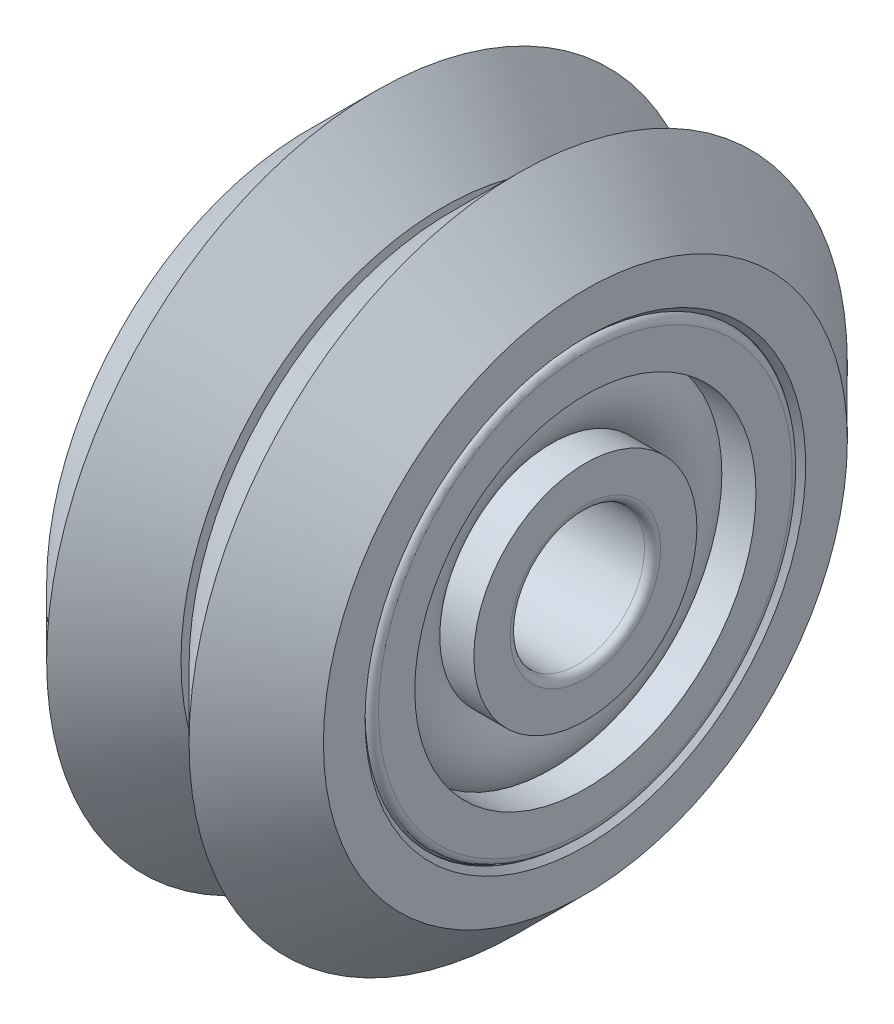
ISO-10303-21;
HEADER;
FILE_DESCRIPTION(('STEP AP214'),'2;1');
FILE_NAME('part.step','',(''),(''),'','','');
FILE_SCHEMA(('AUTOMOTIVE_DESIGN { 1 0 10303 214 1 1 1 1 }'));
ENDSEC;
DATA;
#1=APPLICATION_CONTEXT('core data for automotive mechanical design processes');
#2=APPLICATION_PROTOCOL_DEFINITION('international standard','automotive_design',2000,#1);
#3=PRODUCT_CONTEXT('',#1,'mechanical');
#4=PRODUCT('Part','Part','',(#3));
#5=PRODUCT_RELATED_PRODUCT_CATEGORY('part','',(#4));
#6=PRODUCT_DEFINITION_FORMATION('','',#4);
#7=PRODUCT_DEFINITION_CONTEXT('part definition',#1,'design');
#8=PRODUCT_DEFINITION('design','',#6,#7);
#9=PRODUCT_DEFINITION_SHAPE('','',#8);
#10=(LENGTH_UNIT() NAMED_UNIT(*) SI_UNIT(.MILLI.,.METRE.));
#11=(NAMED_UNIT(*) PLANE_ANGLE_UNIT() SI_UNIT($,.RADIAN.));
#12=(NAMED_UNIT(*) SI_UNIT($,.STERADIAN.) SOLID_ANGLE_UNIT());
#13=UNCERTAINTY_MEASURE_WITH_UNIT(LENGTH_MEASURE(1.E-05),#10,'distance_accuracy_value','');
#14=(GEOMETRIC_REPRESENTATION_CONTEXT(3) GLOBAL_UNCERTAINTY_ASSIGNED_CONTEXT((#13)) GLOBAL_UNIT_ASSIGNED_CONTEXT((#10,
#11,#12)) REPRESENTATION_CONTEXT('',''));
#15=CARTESIAN_POINT('',(0.,0.,0.));
#16=DIRECTION('',(0.,0.,1.));
#17=DIRECTION('',(1.,0.,0.));
#18=AXIS2_PLACEMENT_3D('',#15,#16,#17);
#19=CARTESIAN_POINT('',(-4.95,0.,0.));
#20=DIRECTION('',(-1.,0.,0.));
#21=DIRECTION('',(0.,0.,1.));
#22=AXIS2_PLACEMENT_3D('',#19,#20,#21);
#23=CONICAL_SURFACE('',#22,8.,0.785398163397448);
#24=CARTESIAN_POINT('',(-5.14999999999999,0.,0.));
#25=DIRECTION('',(-1.,0.,0.));
#26=DIRECTION('',(0.,0.,1.));
#27=AXIS2_PLACEMENT_3D('',#24,#25,#26);
#28=CIRCLE('',#27,8.19999999999999);
#29=CARTESIAN_POINT('',(-5.14999999999998,0.,8.19999999999999));
#30=VERTEX_POINT('',#29);
#31=EDGE_CURVE('E93',#30,#30,#28,.T.);
#32=ORIENTED_EDGE('',*,*,#31,.T.);
#33=EDGE_LOOP('',(#32));
#34=FACE_BOUND('',#33,.T.);
#35=CARTESIAN_POINT('',(-4.95,0.,0.));
#36=DIRECTION('',(-1.,0.,0.));
#37=DIRECTION('',(0.,0.,1.));
#38=AXIS2_PLACEMENT_3D('',#35,#36,#37);
#39=CIRCLE('',#38,8.);
#40=CARTESIAN_POINT('',(-4.95,0.,8.));
#41=VERTEX_POINT('',#40);
#42=EDGE_CURVE('E11',#41,#41,#39,.T.);
#43=ORIENTED_EDGE('',*,*,#42,.F.);
#44=EDGE_LOOP('',(#43));
#45=FACE_BOUND('',#44,.T.);
#46=ADVANCED_FACE('F41',(#34,#45),#23,.F.);
#47=CARTESIAN_POINT('',(5.15,0.,0.));
#48=DIRECTION('',(-1.,0.,0.));
#49=DIRECTION('',(0.,0.,1.));
#50=AXIS2_PLACEMENT_3D('',#47,#48,#49);
#51=CYLINDRICAL_SURFACE('',#50,8.00000000000001);
#52=ORIENTED_EDGE('',*,*,#42,.T.);
#53=EDGE_LOOP('',(#52));
#54=FACE_BOUND('',#53,.T.);
#55=CARTESIAN_POINT('',(-0.149999999999999,0.,0.));
#56=DIRECTION('',(-1.,0.,0.));
#57=DIRECTION('',(0.,0.,1.));
#58=AXIS2_PLACEMENT_3D('',#55,#56,#57);
#59=CIRCLE('',#58,8.00000000000001);
#60=CARTESIAN_POINT('',(-0.149999999999994,0.,8.00000000000001));
#61=VERTEX_POINT('',#60);
#62=EDGE_CURVE('E47',#61,#61,#59,.T.);
#63=ORIENTED_EDGE('',*,*,#62,.F.);
#64=EDGE_LOOP('',(#63));
#65=FACE_BOUND('',#64,.T.);
#66=ADVANCED_FACE('F111',(#54,#65),#51,.F.);
#67=CARTESIAN_POINT('',(-0.15,6.8,0.));
#68=DIRECTION('',(-1.,0.,0.));
#69=DIRECTION('',(0.,0.,1.));
#70=AXIS2_PLACEMENT_3D('',#67,#68,#69);
#71=PLANE('',#70);
#72=ORIENTED_EDGE('',*,*,#62,.T.);
#73=EDGE_LOOP('',(#72));
#74=FACE_BOUND('',#73,.T.);
#75=CARTESIAN_POINT('',(-0.150000000000001,0.,0.));
#76=DIRECTION('',(-1.,0.,0.));
#77=DIRECTION('',(0.,0.,1.));
#78=AXIS2_PLACEMENT_3D('',#75,#76,#77);
#79=CIRCLE('',#78,6.8);
#80=CARTESIAN_POINT('',(-0.149999999999996,0.,6.8));
#81=VERTEX_POINT('',#80);
#82=EDGE_CURVE('E51',#81,#81,#79,.T.);
#83=ORIENTED_EDGE('',*,*,#82,.F.);
#84=EDGE_LOOP('',(#83));
#85=FACE_BOUND('',#84,.T.);
#86=ADVANCED_FACE('F115',(#74,#85),#71,.T.);
#87=CARTESIAN_POINT('',(5.15,0.,0.));
#88=DIRECTION('',(-1.,0.,0.));
#89=DIRECTION('',(0.,0.,1.));
#90=AXIS2_PLACEMENT_3D('',#87,#88,#89);
#91=CYLINDRICAL_SURFACE('',#90,6.8);
#92=ORIENTED_EDGE('',*,*,#82,.T.);
#93=EDGE_LOOP('',(#92));
#94=FACE_BOUND('',#93,.T.);
#95=CARTESIAN_POINT('',(0.150000000000001,0.,0.));
#96=DIRECTION('',(-1.,0.,0.));
#97=DIRECTION('',(0.,0.,1.));
#98=AXIS2_PLACEMENT_3D('',#95,#96,#97);
#99=CIRCLE('',#98,6.8);
#100=CARTESIAN_POINT('',(0.150000000000006,0.,6.8));
#101=VERTEX_POINT('',#100);
#102=EDGE_CURVE('E55',#101,#101,#99,.T.);
#103=ORIENTED_EDGE('',*,*,#102,.F.);
#104=EDGE_LOOP('',(#103));
#105=FACE_BOUND('',#104,.T.);
#106=ADVANCED_FACE('F119',(#94,#105),#91,.F.);
#107=CARTESIAN_POINT('',(0.150000000000001,8.,0.));
#108=DIRECTION('',(1.,0.,0.));
#109=DIRECTION('',(0.,0.,-1.));
#110=AXIS2_PLACEMENT_3D('',#107,#108,#109);
#111=PLANE('',#110);
#112=ORIENTED_EDGE('',*,*,#102,.T.);
#113=EDGE_LOOP('',(#112));
#114=FACE_BOUND('',#113,.T.);
#115=CARTESIAN_POINT('',(0.150000000000001,0.,0.));
#116=DIRECTION('',(-1.,0.,0.));
#117=DIRECTION('',(0.,0.,1.));
#118=AXIS2_PLACEMENT_3D('',#115,#116,#117);
#119=CIRCLE('',#118,8.);
#120=CARTESIAN_POINT('',(0.150000000000006,0.,8.));
#121=VERTEX_POINT('',#120);
#122=EDGE_CURVE('E60',#121,#121,#119,.T.);
#123=ORIENTED_EDGE('',*,*,#122,.F.);
#124=EDGE_LOOP('',(#123));
#125=FACE_BOUND('',#124,.T.);
#126=ADVANCED_FACE('F125',(#114,#125),#111,.T.);
#127=CARTESIAN_POINT('',(5.15,0.,0.));
#128=DIRECTION('',(-1.,0.,0.));
#129=DIRECTION('',(0.,0.,1.));
#130=AXIS2_PLACEMENT_3D('',#127,#128,#129);
#131=CYLINDRICAL_SURFACE('',#130,8.);
#132=ORIENTED_EDGE('',*,*,#122,.T.);
#133=EDGE_LOOP('',(#132));
#134=FACE_BOUND('',#133,.T.);
#135=CARTESIAN_POINT('',(4.95,0.,0.));
#136=DIRECTION('',(-1.,0.,0.));
#137=DIRECTION('',(0.,0.,1.));
#138=AXIS2_PLACEMENT_3D('',#135,#136,#137);
#139=CIRCLE('',#138,8.);
#140=CARTESIAN_POINT('',(4.95000000000001,0.,8.));
#141=VERTEX_POINT('',#140);
#142=EDGE_CURVE('E63',#141,#141,#139,.T.);
#143=ORIENTED_EDGE('',*,*,#142,.F.);
#144=EDGE_LOOP('',(#143));
#145=FACE_BOUND('',#144,.T.);
#146=ADVANCED_FACE('F129',(#134,#145),#131,.F.);
#147=CARTESIAN_POINT('',(5.14999999999999,0.,0.));
#148=DIRECTION('',(1.,0.,0.));
#149=DIRECTION('',(0.,0.,-1.));
#150=AXIS2_PLACEMENT_3D('',#147,#148,#149);
#151=CONICAL_SURFACE('',#150,8.19999999999999,0.785398163397446);
#152=ORIENTED_EDGE('',*,*,#142,.T.);
#153=EDGE_LOOP('',(#152));
#154=FACE_BOUND('',#153,.T.);
#155=CARTESIAN_POINT('',(5.14999999999999,0.,0.));
#156=DIRECTION('',(-1.,0.,0.));
#157=DIRECTION('',(0.,0.,1.));
#158=AXIS2_PLACEMENT_3D('',#155,#156,#157);
#159=CIRCLE('',#158,8.19999999999999);
#160=CARTESIAN_POINT('',(5.14999999999999,0.,8.19999999999998));
#161=VERTEX_POINT('',#160);
#162=EDGE_CURVE('E66',#161,#161,#159,.T.);
#163=ORIENTED_EDGE('',*,*,#162,.F.);
#164=EDGE_LOOP('',(#163));
#165=FACE_BOUND('',#164,.T.);
#166=ADVANCED_FACE('F133',(#154,#165),#151,.F.);
#167=CARTESIAN_POINT('',(5.14999999999999,9.75000000000002,0.));
#168=DIRECTION('',(1.,0.,0.));
#169=DIRECTION('',(0.,0.,-1.));
#170=AXIS2_PLACEMENT_3D('',#167,#168,#169);
#171=PLANE('',#170);
#172=ORIENTED_EDGE('',*,*,#162,.T.);
#173=EDGE_LOOP('',(#172));
#174=FACE_BOUND('',#173,.T.);
#175=CARTESIAN_POINT('',(5.15,0.,0.));
#176=DIRECTION('',(-1.,0.,0.));
#177=DIRECTION('',(0.,0.,1.));
#178=AXIS2_PLACEMENT_3D('',#175,#176,#177);
#179=CIRCLE('',#178,9.75000000000002);
#180=CARTESIAN_POINT('',(5.15,0.,9.75000000000002));
#181=VERTEX_POINT('',#180);
#182=EDGE_CURVE('E69',#181,#181,#179,.T.);
#183=ORIENTED_EDGE('',*,*,#182,.F.);
#184=EDGE_LOOP('',(#183));
#185=FACE_BOUND('',#184,.T.);
#186=ADVANCED_FACE('F137',(#174,#185),#171,.T.);
#187=CARTESIAN_POINT('',(2.65,0.,0.));
#188=DIRECTION('',(-1.,0.,0.));
#189=DIRECTION('',(0.,0.,1.));
#190=AXIS2_PLACEMENT_3D('',#187,#188,#189);
#191=CONICAL_SURFACE('',#190,12.25,0.785398163397444);
#192=ORIENTED_EDGE('',*,*,#182,.T.);
#193=EDGE_LOOP('',(#192));
#194=FACE_BOUND('',#193,.T.);
#195=CARTESIAN_POINT('',(2.65,0.,0.));
#196=DIRECTION('',(-1.,0.,0.));
#197=DIRECTION('',(0.,0.,1.));
#198=AXIS2_PLACEMENT_3D('',#195,#196,#197);
#199=CIRCLE('',#198,12.25);
#200=CARTESIAN_POINT('',(2.65000000000001,0.,12.25));
#201=VERTEX_POINT('',#200);
#202=EDGE_CURVE('E72',#201,#201,#199,.T.);
#203=ORIENTED_EDGE('',*,*,#202,.F.);
#204=EDGE_LOOP('',(#203));
#205=FACE_BOUND('',#204,.T.);
#206=ADVANCED_FACE('F141',(#194,#205),#191,.T.);
#207=CARTESIAN_POINT('',(0.149999999999983,0.,0.));
#208=DIRECTION('',(1.,0.,0.));
#209=DIRECTION('',(0.,0.,-1.));
#210=AXIS2_PLACEMENT_3D('',#207,#208,#209);
#211=CONICAL_SURFACE('',#210,9.74999999999998,0.785398163397448);
#212=ORIENTED_EDGE('',*,*,#202,.T.);
#213=EDGE_LOOP('',(#212));
#214=FACE_BOUND('',#213,.T.);
#215=CARTESIAN_POINT('',(0.149999999999983,0.,0.));
#216=DIRECTION('',(-1.,0.,0.));
#217=DIRECTION('',(0.,0.,1.));
#218=AXIS2_PLACEMENT_3D('',#215,#216,#217);
#219=CIRCLE('',#218,9.74999999999998);
#220=CARTESIAN_POINT('',(0.14999999999999,0.,9.74999999999998));
#221=VERTEX_POINT('',#220);
#222=EDGE_CURVE('E75',#221,#221,#219,.T.);
#223=ORIENTED_EDGE('',*,*,#222,.F.);
#224=EDGE_LOOP('',(#223));
#225=FACE_BOUND('',#224,.T.);
#226=ADVANCED_FACE('F145',(#214,#225),#211,.T.);
#227=CARTESIAN_POINT('',(0.149999999999992,9.25,0.));
#228=DIRECTION('',(-1.,0.,0.));
#229=DIRECTION('',(0.,0.,1.));
#230=AXIS2_PLACEMENT_3D('',#227,#228,#229);
#231=PLANE('',#230);
#232=ORIENTED_EDGE('',*,*,#222,.T.);
#233=EDGE_LOOP('',(#232));
#234=FACE_BOUND('',#233,.T.);
#235=CARTESIAN_POINT('',(0.150000000000001,0.,0.));
#236=DIRECTION('',(-1.,0.,0.));
#237=DIRECTION('',(0.,0.,1.));
#238=AXIS2_PLACEMENT_3D('',#235,#236,#237);
#239=CIRCLE('',#238,9.25);
#240=CARTESIAN_POINT('',(0.150000000000007,0.,9.25));
#241=VERTEX_POINT('',#240);
#242=EDGE_CURVE('E78',#241,#241,#239,.T.);
#243=ORIENTED_EDGE('',*,*,#242,.F.);
#244=EDGE_LOOP('',(#243));
#245=FACE_BOUND('',#244,.T.);
#246=ADVANCED_FACE('F149',(#234,#245),#231,.T.);
#247=CARTESIAN_POINT('',(5.15,0.,0.));
#248=DIRECTION('',(-1.,0.,0.));
#249=DIRECTION('',(0.,0.,1.));
#250=AXIS2_PLACEMENT_3D('',#247,#248,#249);
#251=CYLINDRICAL_SURFACE('',#250,9.25);
#252=ORIENTED_EDGE('',*,*,#242,.T.);
#253=EDGE_LOOP('',(#252));
#254=FACE_BOUND('',#253,.T.);
#255=CARTESIAN_POINT('',(-0.150000000000001,0.,0.));
#256=DIRECTION('',(-1.,0.,0.));
#257=DIRECTION('',(0.,0.,1.));
#258=AXIS2_PLACEMENT_3D('',#255,#256,#257);
#259=CIRCLE('',#258,9.25);
#260=CARTESIAN_POINT('',(-0.149999999999994,0.,9.25));
#261=VERTEX_POINT('',#260);
#262=EDGE_CURVE('E81',#261,#261,#259,.T.);
#263=ORIENTED_EDGE('',*,*,#262,.F.);
#264=EDGE_LOOP('',(#263));
#265=FACE_BOUND('',#264,.T.);
#266=ADVANCED_FACE('F153',(#254,#265),#251,.T.);
#267=CARTESIAN_POINT('',(-0.150000000000002,9.75,0.));
#268=DIRECTION('',(1.,0.,0.));
#269=DIRECTION('',(0.,0.,-1.));
#270=AXIS2_PLACEMENT_3D('',#267,#268,#269);
#271=PLANE('',#270);
#272=ORIENTED_EDGE('',*,*,#262,.T.);
#273=EDGE_LOOP('',(#272));
#274=FACE_BOUND('',#273,.T.);
#275=CARTESIAN_POINT('',(-0.150000000000003,0.,0.));
#276=DIRECTION('',(-1.,0.,0.));
#277=DIRECTION('',(0.,0.,1.));
#278=AXIS2_PLACEMENT_3D('',#275,#276,#277);
#279=CIRCLE('',#278,9.75);
#280=CARTESIAN_POINT('',(-0.149999999999996,0.,9.75));
#281=VERTEX_POINT('',#280);
#282=EDGE_CURVE('E84',#281,#281,#279,.T.);
#283=ORIENTED_EDGE('',*,*,#282,.F.);
#284=EDGE_LOOP('',(#283));
#285=FACE_BOUND('',#284,.T.);
#286=ADVANCED_FACE('F157',(#274,#285),#271,.T.);
#287=CARTESIAN_POINT('',(-2.65,0.,0.));
#288=DIRECTION('',(-1.,0.,0.));
#289=DIRECTION('',(0.,0.,1.));
#290=AXIS2_PLACEMENT_3D('',#287,#288,#289);
#291=CONICAL_SURFACE('',#290,12.25,0.785398163397449);
#292=ORIENTED_EDGE('',*,*,#282,.T.);
#293=EDGE_LOOP('',(#292));
#294=FACE_BOUND('',#293,.T.);
#295=CARTESIAN_POINT('',(-2.65,0.,0.));
#296=DIRECTION('',(-1.,0.,0.));
#297=DIRECTION('',(0.,0.,1.));
#298=AXIS2_PLACEMENT_3D('',#295,#296,#297);
#299=CIRCLE('',#298,12.25);
#300=CARTESIAN_POINT('',(-2.64999999999999,0.,12.25));
#301=VERTEX_POINT('',#300);
#302=EDGE_CURVE('E87',#301,#301,#299,.T.);
#303=ORIENTED_EDGE('',*,*,#302,.F.);
#304=EDGE_LOOP('',(#303));
#305=FACE_BOUND('',#304,.T.);
#306=ADVANCED_FACE('F107',(#294,#305),#291,.T.);
#307=CARTESIAN_POINT('',(-5.15,0.,0.));
#308=DIRECTION('',(1.,0.,0.));
#309=DIRECTION('',(0.,0.,-1.));
#310=AXIS2_PLACEMENT_3D('',#307,#308,#309);
#311=CONICAL_SURFACE('',#310,9.75000000000003,0.785398163397444);
#312=ORIENTED_EDGE('',*,*,#302,.T.);
#313=EDGE_LOOP('',(#312));
#314=FACE_BOUND('',#313,.T.);
#315=CARTESIAN_POINT('',(-5.15,0.,0.));
#316=DIRECTION('',(-1.,0.,0.));
#317=DIRECTION('',(0.,0.,1.));
#318=AXIS2_PLACEMENT_3D('',#315,#316,#317);
#319=CIRCLE('',#318,9.75000000000003);
#320=CARTESIAN_POINT('',(-5.15,0.,9.75000000000003));
#321=VERTEX_POINT('',#320);
#322=EDGE_CURVE('E90',#321,#321,#319,.T.);
#323=ORIENTED_EDGE('',*,*,#322,.F.);
#324=EDGE_LOOP('',(#323));
#325=FACE_BOUND('',#324,.T.);
#326=ADVANCED_FACE('F101',(#314,#325),#311,.T.);
#327=CARTESIAN_POINT('',(-5.15,8.19999999999999,0.));
#328=DIRECTION('',(-1.,0.,0.));
#329=DIRECTION('',(0.,0.,1.));
#330=AXIS2_PLACEMENT_3D('',#327,#328,#329);
#331=PLANE('',#330);
#332=ORIENTED_EDGE('',*,*,#322,.T.);
#333=EDGE_LOOP('',(#332));
#334=FACE_BOUND('',#333,.T.);
#335=ORIENTED_EDGE('',*,*,#31,.F.);
#336=EDGE_LOOP('',(#335));
#337=FACE_BOUND('',#336,.T.);
#338=ADVANCED_FACE('F99',(#334,#337),#331,.T.);
#339=CLOSED_SHELL('',(#46,#66,#86,#106,#126,#146,#166,#186,#206,#226,#246,#266,#286,#306,#326,#338));
#340=MANIFOLD_SOLID_BREP('B2',#339);
#341=CARTESIAN_POINT('',(-0.449999999471514,4.87792965742084E-10,0.));
#342=DIRECTION('',(1.,0.,0.));
#343=DIRECTION('',(0.,1.,0.));
#344=AXIS2_PLACEMENT_3D('',#341,#342,#343);
#345=TOROIDAL_SURFACE('',#344,2.79999999958671,0.30000000026743);
#346=CARTESIAN_POINT('',(-0.149999999204084,4.87792716730656E-10,0.));
#347=DIRECTION('',(1.,0.,0.));
#348=DIRECTION('',(0.,1.,0.));
#349=AXIS2_PLACEMENT_3D('',#346,#347,#348);
#350=CIRCLE('',#349,2.7999999992623);
#351=CARTESIAN_POINT('',(-0.149999999204082,2.7999999997501,0.));
#352=VERTEX_POINT('',#351);
#353=EDGE_CURVE('E341',#352,#352,#350,.T.);
#354=ORIENTED_EDGE('',*,*,#353,.T.);
#355=EDGE_LOOP('',(#354));
#356=FACE_BOUND('',#355,.T.);
#357=CARTESIAN_POINT('',(-0.449999999782984,4.87792943138969E-10,0.));
#358=DIRECTION('',(1.,0.,0.));
#359=DIRECTION('',(0.,1.,0.));
#360=AXIS2_PLACEMENT_3D('',#357,#358,#359);
#361=CIRCLE('',#360,2.49999999931928);
#362=CARTESIAN_POINT('',(-0.449999999782982,2.49999999980707,0.));
#363=VERTEX_POINT('',#362);
#364=EDGE_CURVE('E40',#363,#363,#361,.T.);
#365=ORIENTED_EDGE('',*,*,#364,.F.);
#366=EDGE_LOOP('',(#365));
#367=FACE_BOUND('',#366,.T.);
#368=ADVANCED_FACE('F289',(#356,#367),#345,.T.);
#369=CARTESIAN_POINT('',(-5.1669363629423,4.87796502984303E-10,0.));
#370=DIRECTION('',(1.,0.,0.));
#371=DIRECTION('',(0.,1.,0.));
#372=AXIS2_PLACEMENT_3D('',#369,#370,#371);
#373=CYLINDRICAL_SURFACE('',#372,2.49999999931928);
#374=ORIENTED_EDGE('',*,*,#364,.T.);
#375=EDGE_LOOP('',(#374));
#376=FACE_BOUND('',#375,.T.);
#377=CARTESIAN_POINT('',(-4.84999999997591,4.87796263794213E-10,0.));
#378=DIRECTION('',(1.,0.,0.));
#379=DIRECTION('',(0.,1.,0.));
#380=AXIS2_PLACEMENT_3D('',#377,#378,#379);
#381=CIRCLE('',#380,2.49999999931928);
#382=CARTESIAN_POINT('',(-4.84999999997591,2.49999999980707,0.));
#383=VERTEX_POINT('',#382);
#384=EDGE_CURVE('E295',#383,#383,#381,.T.);
#385=ORIENTED_EDGE('',*,*,#384,.F.);
#386=EDGE_LOOP('',(#385));
#387=FACE_BOUND('',#386,.T.);
#388=ADVANCED_FACE('F359',(#376,#387),#373,.F.);
#389=CARTESIAN_POINT('',(-4.84999999941278,4.87796001508167E-10,0.));
#390=DIRECTION('',(1.,0.,0.));
#391=DIRECTION('',(0.,1.,0.));
#392=AXIS2_PLACEMENT_3D('',#389,#390,#391);
#393=TOROIDAL_SURFACE('',#392,2.79999999990649,0.300000000587215);
#394=ORIENTED_EDGE('',*,*,#384,.T.);
#395=EDGE_LOOP('',(#394));
#396=FACE_BOUND('',#395,.T.);
#397=CARTESIAN_POINT('',(-5.15,4.87796490202525E-10,0.));
#398=DIRECTION('',(1.,0.,0.));
#399=DIRECTION('',(0.,1.,0.));
#400=AXIS2_PLACEMENT_3D('',#397,#398,#399);
#401=CIRCLE('',#400,2.79999999935225);
#402=CARTESIAN_POINT('',(-5.15,2.79999999984005,0.));
#403=VERTEX_POINT('',#402);
#404=EDGE_CURVE('E299',#403,#403,#401,.T.);
#405=ORIENTED_EDGE('',*,*,#404,.F.);
#406=EDGE_LOOP('',(#405));
#407=FACE_BOUND('',#406,.T.);
#408=ADVANCED_FACE('F363',(#396,#407),#393,.T.);
#409=CARTESIAN_POINT('',(-5.14999999999999,4.15,0.));
#410=DIRECTION('',(-1.,0.,0.));
#411=DIRECTION('',(0.,-1.,0.));
#412=AXIS2_PLACEMENT_3D('',#409,#410,#411);
#413=PLANE('',#412);
#414=ORIENTED_EDGE('',*,*,#404,.T.);
#415=EDGE_LOOP('',(#414));
#416=FACE_BOUND('',#415,.T.);
#417=CARTESIAN_POINT('',(-5.15,4.87796490202525E-10,0.));
#418=DIRECTION('',(1.,0.,0.));
#419=DIRECTION('',(0.,1.,0.));
#420=AXIS2_PLACEMENT_3D('',#417,#418,#419);
#421=CIRCLE('',#420,4.1499999995122);
#422=CARTESIAN_POINT('',(-5.14999999999999,4.15,0.));
#423=VERTEX_POINT('',#422);
#424=EDGE_CURVE('E303',#423,#423,#421,.T.);
#425=ORIENTED_EDGE('',*,*,#424,.F.);
#426=EDGE_LOOP('',(#425));
#427=FACE_BOUND('',#426,.T.);
#428=ADVANCED_FACE('F367',(#416,#427),#413,.T.);
#429=CARTESIAN_POINT('',(-5.1669363629423,4.87796502984303E-10,0.));
#430=DIRECTION('',(1.,0.,0.));
#431=DIRECTION('',(0.,1.,0.));
#432=AXIS2_PLACEMENT_3D('',#429,#430,#431);
#433=CYLINDRICAL_SURFACE('',#432,4.1499999995122);
#434=ORIENTED_EDGE('',*,*,#424,.T.);
#435=EDGE_LOOP('',(#434));
#436=FACE_BOUND('',#435,.T.);
#437=CARTESIAN_POINT('',(-3.8798373872684,4.87795531617948E-10,0.));
#438=DIRECTION('',(1.,0.,0.));
#439=DIRECTION('',(0.,1.,0.));
#440=AXIS2_PLACEMENT_3D('',#437,#438,#439);
#441=CIRCLE('',#440,4.1499999995122);
#442=CARTESIAN_POINT('',(-3.87983738726839,4.15,0.));
#443=VERTEX_POINT('',#442);
#444=EDGE_CURVE('E308',#443,#443,#441,.T.);
#445=ORIENTED_EDGE('',*,*,#444,.F.);
#446=EDGE_LOOP('',(#445));
#447=FACE_BOUND('',#446,.T.);
#448=ADVANCED_FACE('F373',(#436,#447),#433,.T.);
#449=CARTESIAN_POINT('',(-2.64999999880593,4.8779470046556E-10,0.));
#450=DIRECTION('',(1.,0.,0.));
#451=DIRECTION('',(0.,1.,0.));
#452=AXIS2_PLACEMENT_3D('',#449,#450,#451);
#453=TOROIDAL_SURFACE('',#452,5.24999999989737,1.65000000088108);
#454=ORIENTED_EDGE('',*,*,#444,.T.);
#455=EDGE_LOOP('',(#454));
#456=FACE_BOUND('',#455,.T.);
#457=CARTESIAN_POINT('',(-3.87983738766879,4.87795531617948E-10,0.));
#458=DIRECTION('',(1.,0.,0.));
#459=DIRECTION('',(0.,1.,0.));
#460=AXIS2_PLACEMENT_3D('',#457,#458,#459);
#461=CIRCLE('',#460,6.34999999983488);
#462=CARTESIAN_POINT('',(-3.87983738766879,6.35000000032268,0.));
#463=VERTEX_POINT('',#462);
#464=EDGE_CURVE('E311',#463,#463,#461,.T.);
#465=ORIENTED_EDGE('',*,*,#464,.F.);
#466=EDGE_LOOP('',(#465));
#467=FACE_BOUND('',#466,.T.);
#468=ADVANCED_FACE('F377',(#456,#467),#453,.T.);
#469=CARTESIAN_POINT('',(-5.1669363629423,4.87796502984303E-10,0.));
#470=DIRECTION('',(1.,0.,0.));
#471=DIRECTION('',(0.,1.,0.));
#472=AXIS2_PLACEMENT_3D('',#469,#470,#471);
#473=CYLINDRICAL_SURFACE('',#472,6.34999999983488);
#474=ORIENTED_EDGE('',*,*,#464,.T.);
#475=EDGE_LOOP('',(#474));
#476=FACE_BOUND('',#475,.T.);
#477=CARTESIAN_POINT('',(-5.14999999986029,4.87796490202525E-10,0.));
#478=DIRECTION('',(1.,0.,0.));
#479=DIRECTION('',(0.,1.,0.));
#480=AXIS2_PLACEMENT_3D('',#477,#478,#479);
#481=CIRCLE('',#480,6.34999999983488);
#482=CARTESIAN_POINT('',(-5.14999999986028,6.35000000032268,0.));
#483=VERTEX_POINT('',#482);
#484=EDGE_CURVE('E314',#483,#483,#481,.T.);
#485=ORIENTED_EDGE('',*,*,#484,.F.);
#486=EDGE_LOOP('',(#485));
#487=FACE_BOUND('',#486,.T.);
#488=ADVANCED_FACE('F381',(#476,#487),#473,.F.);
#489=CARTESIAN_POINT('',(-5.14999999986028,7.70000000054841,0.));
#490=DIRECTION('',(-1.,0.,0.));
#491=DIRECTION('',(0.,-1.,0.));
#492=AXIS2_PLACEMENT_3D('',#489,#490,#491);
#493=PLANE('',#492);
#494=ORIENTED_EDGE('',*,*,#484,.T.);
#495=EDGE_LOOP('',(#494));
#496=FACE_BOUND('',#495,.T.);
#497=CARTESIAN_POINT('',(-5.14999999986029,4.87796490202525E-10,0.));
#498=DIRECTION('',(1.,0.,0.));
#499=DIRECTION('',(0.,1.,0.));
#500=AXIS2_PLACEMENT_3D('',#497,#498,#499);
#501=CIRCLE('',#500,7.70000000006061);
#502=CARTESIAN_POINT('',(-5.14999999986028,7.70000000054841,0.));
#503=VERTEX_POINT('',#502);
#504=EDGE_CURVE('E317',#503,#503,#501,.T.);
#505=ORIENTED_EDGE('',*,*,#504,.F.);
#506=EDGE_LOOP('',(#505));
#507=FACE_BOUND('',#506,.T.);
#508=ADVANCED_FACE('F385',(#496,#507),#493,.T.);
#509=CARTESIAN_POINT('',(-4.84999999959287,4.87796435189036E-10,0.));
#510=DIRECTION('',(1.,0.,0.));
#511=DIRECTION('',(0.,1.,0.));
#512=AXIS2_PLACEMENT_3D('',#509,#510,#511);
#513=TOROIDAL_SURFACE('',#512,7.69999999973622,0.300000000267419);
#514=ORIENTED_EDGE('',*,*,#504,.T.);
#515=EDGE_LOOP('',(#514));
#516=FACE_BOUND('',#515,.T.);
#517=CARTESIAN_POINT('',(-4.84999999944988,4.87796263794213E-10,0.));
#518=DIRECTION('',(1.,0.,0.));
#519=DIRECTION('',(0.,1.,0.));
#520=AXIS2_PLACEMENT_3D('',#517,#518,#519);
#521=CIRCLE('',#520,8.00000000000364);
#522=CARTESIAN_POINT('',(-4.84999999944988,8.00000000049143,0.));
#523=VERTEX_POINT('',#522);
#524=EDGE_CURVE('E320',#523,#523,#521,.T.);
#525=ORIENTED_EDGE('',*,*,#524,.F.);
#526=EDGE_LOOP('',(#525));
#527=FACE_BOUND('',#526,.T.);
#528=ADVANCED_FACE('F389',(#516,#527),#513,.T.);
#529=CARTESIAN_POINT('',(-5.1669363629423,4.87796502984303E-10,0.));
#530=DIRECTION('',(1.,0.,0.));
#531=DIRECTION('',(0.,1.,0.));
#532=AXIS2_PLACEMENT_3D('',#529,#530,#531);
#533=CYLINDRICAL_SURFACE('',#532,8.00000000000364);
#534=ORIENTED_EDGE('',*,*,#524,.T.);
#535=EDGE_LOOP('',(#534));
#536=FACE_BOUND('',#535,.T.);
#537=CARTESIAN_POINT('',(-0.449999999185068,4.87792943138968E-10,0.));
#538=DIRECTION('',(1.,0.,0.));
#539=DIRECTION('',(0.,1.,0.));
#540=AXIS2_PLACEMENT_3D('',#537,#538,#539);
#541=CIRCLE('',#540,8.00000000000364);
#542=CARTESIAN_POINT('',(-0.449999999185062,8.00000000049143,0.));
#543=VERTEX_POINT('',#542);
#544=EDGE_CURVE('E323',#543,#543,#541,.T.);
#545=ORIENTED_EDGE('',*,*,#544,.F.);
#546=EDGE_LOOP('',(#545));
#547=FACE_BOUND('',#546,.T.);
#548=ADVANCED_FACE('F393',(#536,#547),#533,.T.);
#549=CARTESIAN_POINT('',(-0.449999999651625,4.87792965742084E-10,0.));
#550=DIRECTION('',(1.,0.,0.));
#551=DIRECTION('',(0.,1.,0.));
#552=AXIS2_PLACEMENT_3D('',#549,#550,#551);
#553=TOROIDAL_SURFACE('',#552,7.6999999994164,0.300000000587244);
#554=ORIENTED_EDGE('',*,*,#544,.T.);
#555=EDGE_LOOP('',(#554));
#556=FACE_BOUND('',#555,.T.);
#557=CARTESIAN_POINT('',(-0.149999999064381,4.87792716730656E-10,0.));
#558=DIRECTION('',(1.,0.,0.));
#559=DIRECTION('',(0.,1.,0.));
#560=AXIS2_PLACEMENT_3D('',#557,#558,#559);
#561=CIRCLE('',#560,7.69999999997064);
#562=CARTESIAN_POINT('',(-0.149999999064375,7.70000000045843,0.));
#563=VERTEX_POINT('',#562);
#564=EDGE_CURVE('E326',#563,#563,#561,.T.);
#565=ORIENTED_EDGE('',*,*,#564,.F.);
#566=EDGE_LOOP('',(#565));
#567=FACE_BOUND('',#566,.T.);
#568=ADVANCED_FACE('F397',(#556,#567),#553,.T.);
#569=CARTESIAN_POINT('',(-0.149999999064375,6.35000000032268,0.));
#570=DIRECTION('',(1.,0.,0.));
#571=DIRECTION('',(0.,1.,0.));
#572=AXIS2_PLACEMENT_3D('',#569,#570,#571);
#573=PLANE('',#572);
#574=ORIENTED_EDGE('',*,*,#564,.T.);
#575=EDGE_LOOP('',(#574));
#576=FACE_BOUND('',#575,.T.);
#577=CARTESIAN_POINT('',(-0.14999999906438,4.87792716730656E-10,0.));
#578=DIRECTION('',(1.,0.,0.));
#579=DIRECTION('',(0.,1.,0.));
#580=AXIS2_PLACEMENT_3D('',#577,#578,#579);
#581=CIRCLE('',#580,6.34999999983489);
#582=CARTESIAN_POINT('',(-0.149999999064376,6.35000000032268,0.));
#583=VERTEX_POINT('',#582);
#584=EDGE_CURVE('E329',#583,#583,#581,.T.);
#585=ORIENTED_EDGE('',*,*,#584,.F.);
#586=EDGE_LOOP('',(#585));
#587=FACE_BOUND('',#586,.T.);
#588=ADVANCED_FACE('F401',(#576,#587),#573,.T.);
#589=CARTESIAN_POINT('',(-5.1669363629423,4.87796502984303E-10,0.));
#590=DIRECTION('',(1.,0.,0.));
#591=DIRECTION('',(0.,1.,0.));
#592=AXIS2_PLACEMENT_3D('',#589,#590,#591);
#593=CYLINDRICAL_SURFACE('',#592,6.34999999983489);
#594=ORIENTED_EDGE('',*,*,#584,.T.);
#595=EDGE_LOOP('',(#594));
#596=FACE_BOUND('',#595,.T.);
#597=CARTESIAN_POINT('',(-1.42016261219151,4.87793675315234E-10,0.));
#598=DIRECTION('',(1.,0.,0.));
#599=DIRECTION('',(0.,1.,0.));
#600=AXIS2_PLACEMENT_3D('',#597,#598,#599);
#601=CIRCLE('',#600,6.34999999983489);
#602=CARTESIAN_POINT('',(-1.4201626121915,6.35000000032268,0.));
#603=VERTEX_POINT('',#602);
#604=EDGE_CURVE('E332',#603,#603,#601,.T.);
#605=ORIENTED_EDGE('',*,*,#604,.F.);
#606=EDGE_LOOP('',(#605));
#607=FACE_BOUND('',#606,.T.);
#608=ADVANCED_FACE('F405',(#596,#607),#593,.F.);
#609=CARTESIAN_POINT('',(-2.64999999880593,4.8779470046556E-10,0.));
#610=DIRECTION('',(1.,0.,0.));
#611=DIRECTION('',(0.,1.,0.));
#612=AXIS2_PLACEMENT_3D('',#609,#610,#611);
#613=TOROIDAL_SURFACE('',#612,5.24999999989737,1.64999999920519);
#614=ORIENTED_EDGE('',*,*,#604,.T.);
#615=EDGE_LOOP('',(#614));
#616=FACE_BOUND('',#615,.T.);
#617=CARTESIAN_POINT('',(-1.42016261254728,4.87793675315234E-10,0.));
#618=DIRECTION('',(1.,0.,0.));
#619=DIRECTION('',(0.,1.,0.));
#620=AXIS2_PLACEMENT_3D('',#617,#618,#619);
#621=CIRCLE('',#620,4.14999999956209);
#622=CARTESIAN_POINT('',(-1.42016261254728,4.15000000004988,0.));
#623=VERTEX_POINT('',#622);
#624=EDGE_CURVE('E335',#623,#623,#621,.T.);
#625=ORIENTED_EDGE('',*,*,#624,.F.);
#626=EDGE_LOOP('',(#625));
#627=FACE_BOUND('',#626,.T.);
#628=ADVANCED_FACE('F355',(#616,#627),#613,.T.);
#629=CARTESIAN_POINT('',(-5.1669363629423,4.87796502984303E-10,0.));
#630=DIRECTION('',(1.,0.,0.));
#631=DIRECTION('',(0.,1.,0.));
#632=AXIS2_PLACEMENT_3D('',#629,#630,#631);
#633=CYLINDRICAL_SURFACE('',#632,4.14999999956209);
#634=ORIENTED_EDGE('',*,*,#624,.T.);
#635=EDGE_LOOP('',(#634));
#636=FACE_BOUND('',#635,.T.);
#637=CARTESIAN_POINT('',(-0.149999999204085,4.87792716730656E-10,0.));
#638=DIRECTION('',(1.,0.,0.));
#639=DIRECTION('',(0.,1.,0.));
#640=AXIS2_PLACEMENT_3D('',#637,#638,#639);
#641=CIRCLE('',#640,4.14999999956209);
#642=CARTESIAN_POINT('',(-0.149999999204082,4.15000000004988,0.));
#643=VERTEX_POINT('',#642);
#644=EDGE_CURVE('E338',#643,#643,#641,.T.);
#645=ORIENTED_EDGE('',*,*,#644,.F.);
#646=EDGE_LOOP('',(#645));
#647=FACE_BOUND('',#646,.T.);
#648=ADVANCED_FACE('F349',(#636,#647),#633,.T.);
#649=CARTESIAN_POINT('',(-0.149999999204083,2.7999999997501,0.));
#650=DIRECTION('',(1.,0.,0.));
#651=DIRECTION('',(0.,1.,0.));
#652=AXIS2_PLACEMENT_3D('',#649,#650,#651);
#653=PLANE('',#652);
#654=ORIENTED_EDGE('',*,*,#644,.T.);
#655=EDGE_LOOP('',(#654));
#656=FACE_BOUND('',#655,.T.);
#657=ORIENTED_EDGE('',*,*,#353,.F.);
#658=EDGE_LOOP('',(#657));
#659=FACE_BOUND('',#658,.T.);
#660=ADVANCED_FACE('F347',(#656,#659),#653,.T.);
#661=CLOSED_SHELL('',(#368,#388,#408,#428,#448,#468,#488,#508,#528,#548,#568,#588,#608,#628,
#648,#660));
#662=MANIFOLD_SOLID_BREP('B6',#661);
#663=CARTESIAN_POINT('',(0.449999999471517,4.87794266784691E-10,0.));
#664=DIRECTION('',(-1.,0.,0.));
#665=DIRECTION('',(0.,0.,1.));
#666=AXIS2_PLACEMENT_3D('',#663,#664,#665);
#667=TOROIDAL_SURFACE('',#666,2.79999999958671,0.30000000026743);
#668=CARTESIAN_POINT('',(0.149999999204086,4.87794450191529E-10,0.));
#669=DIRECTION('',(-1.,0.,0.));
#670=DIRECTION('',(0.,0.,1.));
#671=AXIS2_PLACEMENT_3D('',#668,#669,#670);
#672=CIRCLE('',#671,2.79999999958671);
#673=CARTESIAN_POINT('',(0.149999999204088,4.87794450191529E-10,2.79999999958671));
#674=VERTEX_POINT('',#673);
#675=EDGE_CURVE('E288',#674,#674,#672,.T.);
#676=ORIENTED_EDGE('',*,*,#675,.T.);
#677=EDGE_LOOP('',(#676));
#678=FACE_BOUND('',#677,.T.);
#679=CARTESIAN_POINT('',(0.449999999471516,4.87794283432787E-10,0.));
#680=DIRECTION('',(-1.,0.,0.));
#681=DIRECTION('',(0.,0.,1.));
#682=AXIS2_PLACEMENT_3D('',#679,#680,#681);
#683=CIRCLE('',#682,2.49999999931928);
#684=CARTESIAN_POINT('',(0.449999999471518,4.87794283432787E-10,2.49999999931928));
#685=VERTEX_POINT('',#684);
#686=EDGE_CURVE('E582',#685,#685,#683,.T.);
#687=ORIENTED_EDGE('',*,*,#686,.F.);
#688=EDGE_LOOP('',(#687));
#689=FACE_BOUND('',#688,.T.);
#690=ADVANCED_FACE('F530',(#678,#689),#667,.T.);
#691=CARTESIAN_POINT('',(0.149999999204088,2.8000000000745,0.));
#692=DIRECTION('',(-1.,0.,0.));
#693=DIRECTION('',(0.,0.,1.));
#694=AXIS2_PLACEMENT_3D('',#691,#692,#693);
#695=PLANE('',#694);
#696=CARTESIAN_POINT('',(0.149999999204085,4.87794450191529E-10,0.));
#697=DIRECTION('',(-1.,0.,0.));
#698=DIRECTION('',(0.,0.,1.));
#699=AXIS2_PLACEMENT_3D('',#696,#697,#698);
#700=CIRCLE('',#699,4.14999999918953);
#701=CARTESIAN_POINT('',(0.149999999204088,4.87794450191529E-10,4.14999999918953));
#702=VERTEX_POINT('',#701);
#703=EDGE_CURVE('E536',#702,#702,#700,.T.);
#704=ORIENTED_EDGE('',*,*,#703,.T.);
#705=EDGE_LOOP('',(#704));
#706=FACE_BOUND('',#705,.T.);
#707=ORIENTED_EDGE('',*,*,#675,.F.);
#708=EDGE_LOOP('',(#707));
#709=FACE_BOUND('',#708,.T.);
#710=ADVANCED_FACE('F590',(#706,#709),#695,.T.);
#711=CARTESIAN_POINT('',(5.16693636294229,4.87791661464866E-10,0.));
#712=DIRECTION('',(-1.,0.,0.));
#713=DIRECTION('',(0.,0.,1.));
#714=AXIS2_PLACEMENT_3D('',#711,#712,#713);
#715=CYLINDRICAL_SURFACE('',#714,4.14999999918953);
#716=CARTESIAN_POINT('',(1.42016261268702,4.87793744155795E-10,0.));
#717=DIRECTION('',(-1.,0.,0.));
#718=DIRECTION('',(0.,0.,1.));
#719=AXIS2_PLACEMENT_3D('',#716,#717,#718);
#720=CIRCLE('',#719,4.14999999918953);
#721=CARTESIAN_POINT('',(1.42016261268703,4.87793744155795E-10,4.14999999918953));
#722=VERTEX_POINT('',#721);
#723=EDGE_CURVE('E540',#722,#722,#720,.T.);
#724=ORIENTED_EDGE('',*,*,#723,.T.);
#725=EDGE_LOOP('',(#724));
#726=FACE_BOUND('',#725,.T.);
#727=ORIENTED_EDGE('',*,*,#703,.F.);
#728=EDGE_LOOP('',(#727));
#729=FACE_BOUND('',#728,.T.);
#730=ADVANCED_FACE('F594',(#726,#729),#715,.T.);
#731=CARTESIAN_POINT('',(2.64999999997771,4.87792965742084E-10,0.));
#732=DIRECTION('',(-1.,0.,0.));
#733=DIRECTION('',(0.,0.,1.));
#734=AXIS2_PLACEMENT_3D('',#731,#732,#733);
#735=TOROIDAL_SURFACE('',#734,5.25000000088479,1.65000000088108);
#736=CARTESIAN_POINT('',(1.42016261211416,4.87793744155796E-10,0.));
#737=DIRECTION('',(-1.,0.,0.));
#738=DIRECTION('',(0.,0.,1.));
#739=AXIS2_PLACEMENT_3D('',#736,#737,#738);
#740=CIRCLE('',#739,6.35000000193957);
#741=CARTESIAN_POINT('',(1.42016261211416,4.87793744155796E-10,6.35000000193957));
#742=VERTEX_POINT('',#741);
#743=EDGE_CURVE('E544',#742,#742,#740,.T.);
#744=ORIENTED_EDGE('',*,*,#743,.T.);
#745=EDGE_LOOP('',(#744));
#746=FACE_BOUND('',#745,.T.);
#747=ORIENTED_EDGE('',*,*,#723,.F.);
#748=EDGE_LOOP('',(#747));
#749=FACE_BOUND('',#748,.T.);
#750=ADVANCED_FACE('F598',(#746,#749),#735,.T.);
#751=CARTESIAN_POINT('',(5.16693636294229,4.87791661464866E-10,0.));
#752=DIRECTION('',(-1.,0.,0.));
#753=DIRECTION('',(0.,0.,1.));
#754=AXIS2_PLACEMENT_3D('',#751,#752,#753);
#755=CYLINDRICAL_SURFACE('',#754,6.35000000193957);
#756=CARTESIAN_POINT('',(0.149999999204085,4.87794450191529E-10,0.));
#757=DIRECTION('',(-1.,0.,0.));
#758=DIRECTION('',(0.,0.,1.));
#759=AXIS2_PLACEMENT_3D('',#756,#757,#758);
#760=CIRCLE('',#759,6.35000000193957);
#761=CARTESIAN_POINT('',(0.149999999204089,4.87794450191529E-10,6.35000000193957));
#762=VERTEX_POINT('',#761);
#763=EDGE_CURVE('E549',#762,#762,#760,.T.);
#764=ORIENTED_EDGE('',*,*,#763,.T.);
#765=EDGE_LOOP('',(#764));
#766=FACE_BOUND('',#765,.T.);
#767=ORIENTED_EDGE('',*,*,#743,.F.);
#768=EDGE_LOOP('',(#767));
#769=FACE_BOUND('',#768,.T.);
#770=ADVANCED_FACE('F605',(#766,#769),#755,.F.);
#771=CARTESIAN_POINT('',(0.149999999204088,6.35000000242737,0.));
#772=DIRECTION('',(-1.,0.,0.));
#773=DIRECTION('',(0.,0.,1.));
#774=AXIS2_PLACEMENT_3D('',#771,#772,#773);
#775=PLANE('',#774);
#776=CARTESIAN_POINT('',(0.149999999204084,4.87794450191529E-10,0.));
#777=DIRECTION('',(-1.,0.,0.));
#778=DIRECTION('',(0.,0.,1.));
#779=AXIS2_PLACEMENT_3D('',#776,#777,#778);
#780=CIRCLE('',#779,7.69999999909373);
#781=CARTESIAN_POINT('',(0.149999999204089,4.87794450191529E-10,7.69999999909373));
#782=VERTEX_POINT('',#781);
#783=EDGE_CURVE('E552',#782,#782,#780,.T.);
#784=ORIENTED_EDGE('',*,*,#783,.T.);
#785=EDGE_LOOP('',(#784));
#786=FACE_BOUND('',#785,.T.);
#787=ORIENTED_EDGE('',*,*,#763,.F.);
#788=EDGE_LOOP('',(#787));
#789=FACE_BOUND('',#788,.T.);
#790=ADVANCED_FACE('F609',(#786,#789),#775,.T.);
#791=CARTESIAN_POINT('',(0.449999999791319,4.87793833103822E-10,0.));
#792=DIRECTION('',(-1.,0.,0.));
#793=DIRECTION('',(0.,0.,1.));
#794=AXIS2_PLACEMENT_3D('',#791,#792,#793);
#795=TOROIDAL_SURFACE('',#794,7.69999999909373,0.300000000587237);
#796=CARTESIAN_POINT('',(0.44999999979132,4.87794283432786E-10,0.));
#797=DIRECTION('',(-1.,0.,0.));
#798=DIRECTION('',(0.,0.,1.));
#799=AXIS2_PLACEMENT_3D('',#796,#797,#798);
#800=CIRCLE('',#799,7.99999999968096);
#801=CARTESIAN_POINT('',(0.449999999791325,4.87794283432786E-10,7.99999999968096));
#802=VERTEX_POINT('',#801);
#803=EDGE_CURVE('E555',#802,#802,#800,.T.);
#804=ORIENTED_EDGE('',*,*,#803,.T.);
#805=EDGE_LOOP('',(#804));
#806=FACE_BOUND('',#805,.T.);
#807=ORIENTED_EDGE('',*,*,#783,.F.);
#808=EDGE_LOOP('',(#807));
#809=FACE_BOUND('',#808,.T.);
#810=ADVANCED_FACE('F613',(#806,#809),#795,.T.);
#811=CARTESIAN_POINT('',(5.16693636294229,4.87791661464866E-10,0.));
#812=DIRECTION('',(-1.,0.,0.));
#813=DIRECTION('',(0.,0.,1.));
#814=AXIS2_PLACEMENT_3D('',#811,#812,#813);
#815=CYLINDRICAL_SURFACE('',#814,7.99999999968096);
#816=CARTESIAN_POINT('',(4.84999999973257,4.87791837637897E-10,0.));
#817=DIRECTION('',(-1.,0.,0.));
#818=DIRECTION('',(0.,0.,1.));
#819=AXIS2_PLACEMENT_3D('',#816,#817,#818);
#820=CIRCLE('',#819,7.99999999968097);
#821=CARTESIAN_POINT('',(4.84999999973258,4.87791837637897E-10,7.99999999968096));
#822=VERTEX_POINT('',#821);
#823=EDGE_CURVE('E558',#822,#822,#820,.T.);
#824=ORIENTED_EDGE('',*,*,#823,.T.);
#825=EDGE_LOOP('',(#824));
#826=FACE_BOUND('',#825,.T.);
#827=ORIENTED_EDGE('',*,*,#803,.F.);
#828=EDGE_LOOP('',(#827));
#829=FACE_BOUND('',#828,.T.);
#830=ADVANCED_FACE('F617',(#826,#829),#815,.T.);
#831=CARTESIAN_POINT('',(4.84999999973257,4.87791231018608E-10,0.));
#832=DIRECTION('',(-1.,0.,0.));
#833=DIRECTION('',(0.,0.,1.));
#834=AXIS2_PLACEMENT_3D('',#831,#832,#833);
#835=TOROIDAL_SURFACE('',#834,7.69999999941354,0.300000000267423);
#836=CARTESIAN_POINT('',(5.15,4.87791670879155E-10,0.));
#837=DIRECTION('',(-1.,0.,0.));
#838=DIRECTION('',(0.,0.,1.));
#839=AXIS2_PLACEMENT_3D('',#836,#837,#838);
#840=CIRCLE('',#839,7.69999999941354);
#841=CARTESIAN_POINT('',(5.15,4.87791670879155E-10,7.69999999941354));
#842=VERTEX_POINT('',#841);
#843=EDGE_CURVE('E561',#842,#842,#840,.T.);
#844=ORIENTED_EDGE('',*,*,#843,.T.);
#845=EDGE_LOOP('',(#844));
#846=FACE_BOUND('',#845,.T.);
#847=ORIENTED_EDGE('',*,*,#823,.F.);
#848=EDGE_LOOP('',(#847));
#849=FACE_BOUND('',#848,.T.);
#850=ADVANCED_FACE('F621',(#846,#849),#835,.T.);
#851=CARTESIAN_POINT('',(5.15,7.69999999990133,0.));
#852=DIRECTION('',(1.,0.,0.));
#853=DIRECTION('',(0.,0.,-1.));
#854=AXIS2_PLACEMENT_3D('',#851,#852,#853);
#855=PLANE('',#854);
#856=CARTESIAN_POINT('',(5.15,4.87791670879155E-10,0.));
#857=DIRECTION('',(-1.,0.,0.));
#858=DIRECTION('',(0.,0.,1.));
#859=AXIS2_PLACEMENT_3D('',#856,#857,#858);
#860=CIRCLE('',#859,6.35000000193957);
#861=CARTESIAN_POINT('',(5.15,4.87791670879155E-10,6.35000000193957));
#862=VERTEX_POINT('',#861);
#863=EDGE_CURVE('E564',#862,#862,#860,.T.);
#864=ORIENTED_EDGE('',*,*,#863,.T.);
#865=EDGE_LOOP('',(#864));
#866=FACE_BOUND('',#865,.T.);
#867=ORIENTED_EDGE('',*,*,#843,.F.);
#868=EDGE_LOOP('',(#867));
#869=FACE_BOUND('',#868,.T.);
#870=ADVANCED_FACE('F625',(#866,#869),#855,.T.);
#871=CARTESIAN_POINT('',(5.16693636294229,4.87791661464866E-10,0.));
#872=DIRECTION('',(-1.,0.,0.));
#873=DIRECTION('',(0.,0.,1.));
#874=AXIS2_PLACEMENT_3D('',#871,#872,#873);
#875=CYLINDRICAL_SURFACE('',#874,6.35000000193957);
#876=CARTESIAN_POINT('',(3.87983738784126,4.87792376914888E-10,0.));
#877=DIRECTION('',(-1.,0.,0.));
#878=DIRECTION('',(0.,0.,1.));
#879=AXIS2_PLACEMENT_3D('',#876,#877,#878);
#880=CIRCLE('',#879,6.35000000193957);
#881=CARTESIAN_POINT('',(3.87983738784127,4.87792376914888E-10,6.35000000193957));
#882=VERTEX_POINT('',#881);
#883=EDGE_CURVE('E567',#882,#882,#880,.T.);
#884=ORIENTED_EDGE('',*,*,#883,.T.);
#885=EDGE_LOOP('',(#884));
#886=FACE_BOUND('',#885,.T.);
#887=ORIENTED_EDGE('',*,*,#863,.F.);
#888=EDGE_LOOP('',(#887));
#889=FACE_BOUND('',#888,.T.);
#890=ADVANCED_FACE('F629',(#886,#889),#875,.F.);
#891=CARTESIAN_POINT('',(2.64999999997771,4.87792965742084E-10,0.));
#892=DIRECTION('',(-1.,0.,0.));
#893=DIRECTION('',(0.,0.,1.));
#894=AXIS2_PLACEMENT_3D('',#891,#892,#893);
#895=TOROIDAL_SURFACE('',#894,5.25000000088479,1.65000000088108);
#896=CARTESIAN_POINT('',(3.8798373872684,4.87792376914888E-10,0.));
#897=DIRECTION('',(-1.,0.,0.));
#898=DIRECTION('',(0.,0.,1.));
#899=AXIS2_PLACEMENT_3D('',#896,#897,#898);
#900=CIRCLE('',#899,4.14999999918953);
#901=CARTESIAN_POINT('',(3.8798373872684,4.87792376914888E-10,4.14999999918953));
#902=VERTEX_POINT('',#901);
#903=EDGE_CURVE('E570',#902,#902,#900,.T.);
#904=ORIENTED_EDGE('',*,*,#903,.T.);
#905=EDGE_LOOP('',(#904));
#906=FACE_BOUND('',#905,.T.);
#907=ORIENTED_EDGE('',*,*,#883,.F.);
#908=EDGE_LOOP('',(#907));
#909=FACE_BOUND('',#908,.T.);
#910=ADVANCED_FACE('F633',(#906,#909),#895,.T.);
#911=CARTESIAN_POINT('',(5.16693636294229,4.87791661464866E-10,0.));
#912=DIRECTION('',(-1.,0.,0.));
#913=DIRECTION('',(0.,0.,1.));
#914=AXIS2_PLACEMENT_3D('',#911,#912,#913);
#915=CYLINDRICAL_SURFACE('',#914,4.14999999918953);
#916=CARTESIAN_POINT('',(5.15,4.87791670879155E-10,0.));
#917=DIRECTION('',(-1.,0.,0.));
#918=DIRECTION('',(0.,0.,1.));
#919=AXIS2_PLACEMENT_3D('',#916,#917,#918);
#920=CIRCLE('',#919,4.14999999918953);
#921=CARTESIAN_POINT('',(5.15,4.87791670879155E-10,4.14999999918953));
#922=VERTEX_POINT('',#921);
#923=EDGE_CURVE('E573',#922,#922,#920,.T.);
#924=ORIENTED_EDGE('',*,*,#923,.T.);
#925=EDGE_LOOP('',(#924));
#926=FACE_BOUND('',#925,.T.);
#927=ORIENTED_EDGE('',*,*,#903,.F.);
#928=EDGE_LOOP('',(#927));
#929=FACE_BOUND('',#928,.T.);
#930=ADVANCED_FACE('F637',(#926,#929),#915,.T.);
#931=CARTESIAN_POINT('',(5.15,4.14999999967732,0.));
#932=DIRECTION('',(1.,0.,0.));
#933=DIRECTION('',(0.,0.,-1.));
#934=AXIS2_PLACEMENT_3D('',#931,#932,#933);
#935=PLANE('',#934);
#936=CARTESIAN_POINT('',(5.15,4.87791670879155E-10,0.));
#937=DIRECTION('',(-1.,0.,0.));
#938=DIRECTION('',(0.,0.,1.));
#939=AXIS2_PLACEMENT_3D('',#936,#937,#938);
#940=CIRCLE('',#939,2.7999999999065);
#941=CARTESIAN_POINT('',(5.15,4.87791670879155E-10,2.7999999999065));
#942=VERTEX_POINT('',#941);
#943=EDGE_CURVE('E576',#942,#942,#940,.T.);
#944=ORIENTED_EDGE('',*,*,#943,.T.);
#945=EDGE_LOOP('',(#944));
#946=FACE_BOUND('',#945,.T.);
#947=ORIENTED_EDGE('',*,*,#923,.F.);
#948=EDGE_LOOP('',(#947));
#949=FACE_BOUND('',#948,.T.);
#950=ADVANCED_FACE('F641',(#946,#949),#935,.T.);
#951=CARTESIAN_POINT('',(4.84999999941278,4.87791664699477E-10,0.));
#952=DIRECTION('',(-1.,0.,0.));
#953=DIRECTION('',(0.,0.,1.));
#954=AXIS2_PLACEMENT_3D('',#951,#952,#953);
#955=TOROIDAL_SURFACE('',#954,2.7999999999065,0.300000000587218);
#956=CARTESIAN_POINT('',(4.84999999941278,4.87791837637898E-10,0.));
#957=DIRECTION('',(-1.,0.,0.));
#958=DIRECTION('',(0.,0.,1.));
#959=AXIS2_PLACEMENT_3D('',#956,#957,#958);
#960=CIRCLE('',#959,2.49999999931928);
#961=CARTESIAN_POINT('',(4.84999999941278,4.87791837637898E-10,2.49999999931928));
#962=VERTEX_POINT('',#961);
#963=EDGE_CURVE('E579',#962,#962,#960,.T.);
#964=ORIENTED_EDGE('',*,*,#963,.T.);
#965=EDGE_LOOP('',(#964));
#966=FACE_BOUND('',#965,.T.);
#967=ORIENTED_EDGE('',*,*,#943,.F.);
#968=EDGE_LOOP('',(#967));
#969=FACE_BOUND('',#968,.T.);
#970=ADVANCED_FACE('F645',(#966,#969),#955,.T.);
#971=CARTESIAN_POINT('',(5.16693636294229,4.87791661464866E-10,0.));
#972=DIRECTION('',(-1.,0.,0.));
#973=DIRECTION('',(0.,0.,1.));
#974=AXIS2_PLACEMENT_3D('',#971,#972,#973);
#975=CYLINDRICAL_SURFACE('',#974,2.49999999931928);
#976=ORIENTED_EDGE('',*,*,#686,.T.);
#977=EDGE_LOOP('',(#976));
#978=FACE_BOUND('',#977,.T.);
#979=ORIENTED_EDGE('',*,*,#963,.F.);
#980=EDGE_LOOP('',(#979));
#981=FACE_BOUND('',#980,.T.);
#982=ADVANCED_FACE('F586',(#978,#981),#975,.F.);
#983=CLOSED_SHELL('',(#690,#710,#730,#750,#770,#790,#810,#830,#850,#870,#890,#910,#930,#950,
#970,#982));
#984=MANIFOLD_SOLID_BREP('B35',#983);
#985=ADVANCED_BREP_SHAPE_REPRESENTATION('',(#18,#340,#662,#984),#14);
#986=SHAPE_DEFINITION_REPRESENTATION(#9,#985);
ENDSEC;
END-ISO-10303-21;
